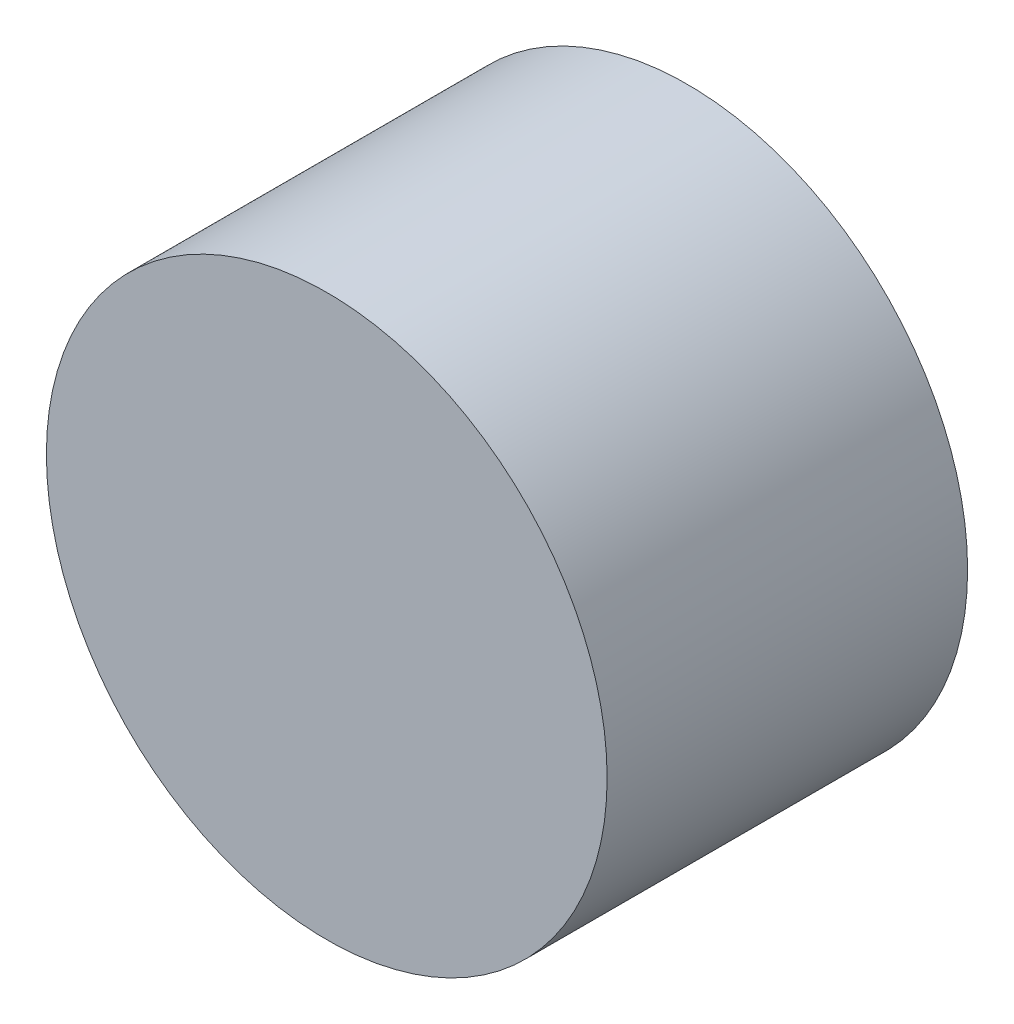
ISO-10303-21;
HEADER;
FILE_DESCRIPTION(('STEP AP214'),'2;1');
FILE_NAME('part.step','',(''),(''),'','','');
FILE_SCHEMA(('AUTOMOTIVE_DESIGN { 1 0 10303 214 1 1 1 1 }'));
ENDSEC;
DATA;
#1=APPLICATION_CONTEXT('core data for automotive mechanical design processes');
#2=APPLICATION_PROTOCOL_DEFINITION('international standard','automotive_design',2000,#1);
#3=PRODUCT_CONTEXT('',#1,'mechanical');
#4=PRODUCT('Part','Part','',(#3));
#5=PRODUCT_RELATED_PRODUCT_CATEGORY('part','',(#4));
#6=PRODUCT_DEFINITION_FORMATION('','',#4);
#7=PRODUCT_DEFINITION_CONTEXT('part definition',#1,'design');
#8=PRODUCT_DEFINITION('design','',#6,#7);
#9=PRODUCT_DEFINITION_SHAPE('','',#8);
#10=(LENGTH_UNIT() NAMED_UNIT(*) SI_UNIT(.MILLI.,.METRE.));
#11=(NAMED_UNIT(*) PLANE_ANGLE_UNIT() SI_UNIT($,.RADIAN.));
#12=(NAMED_UNIT(*) SI_UNIT($,.STERADIAN.) SOLID_ANGLE_UNIT());
#13=UNCERTAINTY_MEASURE_WITH_UNIT(LENGTH_MEASURE(1.E-05),#10,'distance_accuracy_value','');
#14=(GEOMETRIC_REPRESENTATION_CONTEXT(3) GLOBAL_UNCERTAINTY_ASSIGNED_CONTEXT((#13)) GLOBAL_UNIT_ASSIGNED_CONTEXT((#10,
#11,#12)) REPRESENTATION_CONTEXT('',''));
#15=CARTESIAN_POINT('',(0.,0.,0.));
#16=DIRECTION('',(0.,0.,1.));
#17=DIRECTION('',(1.,0.,0.));
#18=AXIS2_PLACEMENT_3D('',#15,#16,#17);
#19=CARTESIAN_POINT('',(0.,0.,18.));
#20=DIRECTION('',(0.,0.,-1.));
#21=DIRECTION('',(-1.,0.,0.));
#22=AXIS2_PLACEMENT_3D('',#19,#20,#21);
#23=CYLINDRICAL_SURFACE('',#22,14.);
#24=CARTESIAN_POINT('',(0.,0.,18.));
#25=DIRECTION('',(0.,0.,1.));
#26=DIRECTION('',(1.,0.,0.));
#27=AXIS2_PLACEMENT_3D('',#24,#25,#26);
#28=CIRCLE('',#27,14.);
#29=CARTESIAN_POINT('',(14.,0.,18.));
#30=VERTEX_POINT('',#29);
#31=EDGE_CURVE('E10',#30,#30,#28,.T.);
#32=ORIENTED_EDGE('',*,*,#31,.F.);
#33=EDGE_LOOP('',(#32));
#34=FACE_BOUND('',#33,.T.);
#35=CARTESIAN_POINT('',(0.,0.,0.));
#36=DIRECTION('',(0.,0.,1.));
#37=DIRECTION('',(1.,0.,0.));
#38=AXIS2_PLACEMENT_3D('',#35,#36,#37);
#39=CIRCLE('',#38,14.);
#40=CARTESIAN_POINT('',(14.,0.,0.));
#41=VERTEX_POINT('',#40);
#42=EDGE_CURVE('E45',#41,#41,#39,.T.);
#43=ORIENTED_EDGE('',*,*,#42,.T.);
#44=EDGE_LOOP('',(#43));
#45=FACE_BOUND('',#44,.T.);
#46=ADVANCED_FACE('F39',(#34,#45),#23,.T.);
#47=CARTESIAN_POINT('',(0.,0.,18.));
#48=DIRECTION('',(0.,0.,1.));
#49=DIRECTION('',(1.,0.,0.));
#50=AXIS2_PLACEMENT_3D('',#47,#48,#49);
#51=PLANE('',#50);
#52=ORIENTED_EDGE('',*,*,#31,.T.);
#53=EDGE_LOOP('',(#52));
#54=FACE_BOUND('',#53,.T.);
#55=ADVANCED_FACE('F53',(#54),#51,.T.);
#56=CARTESIAN_POINT('',(0.,0.,0.));
#57=DIRECTION('',(0.,0.,1.));
#58=DIRECTION('',(1.,0.,0.));
#59=AXIS2_PLACEMENT_3D('',#56,#57,#58);
#60=PLANE('',#59);
#61=ORIENTED_EDGE('',*,*,#42,.F.);
#62=EDGE_LOOP('',(#61));
#63=FACE_BOUND('',#62,.T.);
#64=ADVANCED_FACE('F55',(#63),#60,.F.);
#65=CLOSED_SHELL('',(#46,#55,#64));
#66=MANIFOLD_SOLID_BREP('B2',#65);
#67=ADVANCED_BREP_SHAPE_REPRESENTATION('',(#18,#66),#14);
#68=SHAPE_DEFINITION_REPRESENTATION(#9,#67);
ENDSEC;
END-ISO-10303-21;
